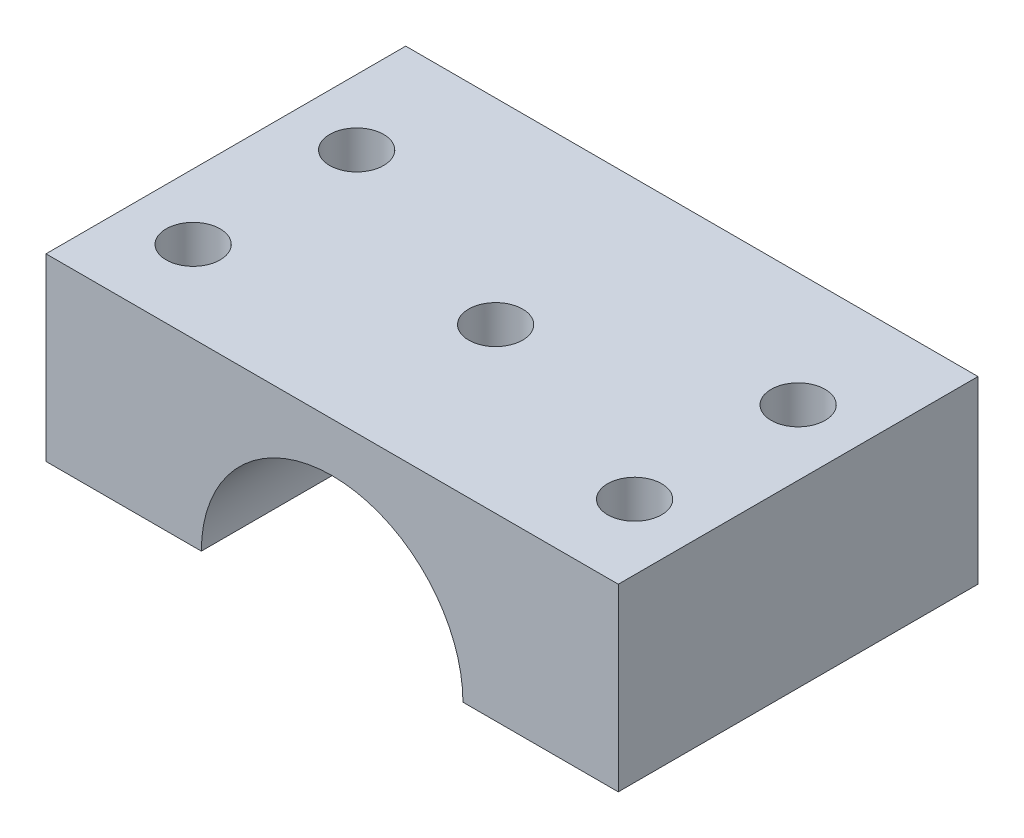
ISO-10303-21;
HEADER;
FILE_DESCRIPTION(('STEP AP214'),'2;1');
FILE_NAME('part.step','',(''),(''),'','','');
FILE_SCHEMA(('AUTOMOTIVE_DESIGN { 1 0 10303 214 1 1 1 1 }'));
ENDSEC;
DATA;
#1=APPLICATION_CONTEXT('core data for automotive mechanical design processes');
#2=APPLICATION_PROTOCOL_DEFINITION('international standard','automotive_design',2000,#1);
#3=PRODUCT_CONTEXT('',#1,'mechanical');
#4=PRODUCT('Part','Part','',(#3));
#5=PRODUCT_RELATED_PRODUCT_CATEGORY('part','',(#4));
#6=PRODUCT_DEFINITION_FORMATION('','',#4);
#7=PRODUCT_DEFINITION_CONTEXT('part definition',#1,'design');
#8=PRODUCT_DEFINITION('design','',#6,#7);
#9=PRODUCT_DEFINITION_SHAPE('','',#8);
#10=(LENGTH_UNIT() NAMED_UNIT(*) SI_UNIT(.MILLI.,.METRE.));
#11=(NAMED_UNIT(*) PLANE_ANGLE_UNIT() SI_UNIT($,.RADIAN.));
#12=(NAMED_UNIT(*) SI_UNIT($,.STERADIAN.) SOLID_ANGLE_UNIT());
#13=UNCERTAINTY_MEASURE_WITH_UNIT(LENGTH_MEASURE(1.E-05),#10,'distance_accuracy_value','');
#14=(GEOMETRIC_REPRESENTATION_CONTEXT(3) GLOBAL_UNCERTAINTY_ASSIGNED_CONTEXT((#13)) GLOBAL_UNIT_ASSIGNED_CONTEXT((#10,
#11,#12)) REPRESENTATION_CONTEXT('',''));
#15=CARTESIAN_POINT('',(0.,0.,0.));
#16=DIRECTION('',(0.,0.,1.));
#17=DIRECTION('',(1.,0.,0.));
#18=AXIS2_PLACEMENT_3D('',#15,#16,#17);
#19=CARTESIAN_POINT('',(0.,0.,22.));
#20=DIRECTION('',(0.,0.,-1.));
#21=DIRECTION('',(-1.,0.,0.));
#22=AXIS2_PLACEMENT_3D('',#19,#20,#21);
#23=CYLINDRICAL_SURFACE('',#22,8.00000000000002);
#24=CARTESIAN_POINT('',(0.,8.00000000000002,10.35));
#25=CARTESIAN_POINT('',(-0.0916407195421214,7.99999830466003,10.3500032970978));
#26=CARTESIAN_POINT('',(-0.183322508381991,7.99840926134727,10.3576603551884));
#27=CARTESIAN_POINT('',(-0.364090486799898,7.99222359173559,10.3880595356718));
#28=CARTESIAN_POINT('',(-0.453174626583019,7.98762465402598,10.4108132515387));
#29=CARTESIAN_POINT('',(-0.626107937761394,7.97593225373363,10.4706696077264));
#30=CARTESIAN_POINT('',(-0.709962177239571,7.96884125176523,10.507758097769));
#31=CARTESIAN_POINT('',(-0.870252949930907,7.95293377965834,10.5951882003391));
#32=CARTESIAN_POINT('',(-0.946689842831803,7.94411739325115,10.6455291697771));
#33=CARTESIAN_POINT('',(-1.09107850067237,7.92558648672409,10.7588010629735));
#34=CARTESIAN_POINT('',(-1.15890845453257,7.91586187136438,10.8218856235408));
#35=CARTESIAN_POINT('',(-1.28310256116972,7.8966832180565,10.9585238287823));
#36=CARTESIAN_POINT('',(-1.33946577881408,7.88722920223017,11.0320783264676));
#37=CARTESIAN_POINT('',(-1.43965110093203,7.86956329469157,11.188452611249));
#38=CARTESIAN_POINT('',(-1.48334592346543,7.86136437560848,11.2713555405184));
#39=CARTESIAN_POINT('',(-1.556138374432,7.847280862419,11.4435237634614));
#40=CARTESIAN_POINT('',(-1.58523754222915,7.84139602426696,11.5327883850498));
#41=CARTESIAN_POINT('',(-1.62761489438171,7.8327093467241,11.7138319499983));
#42=CARTESIAN_POINT('',(-1.64110744112713,7.82986577646948,11.805558673182));
#43=CARTESIAN_POINT('',(-1.65255460798121,7.82745807970269,11.9900145510084));
#44=CARTESIAN_POINT('',(-1.65051092017596,7.8278935960578,12.0827435953878));
#45=CARTESIAN_POINT('',(-1.6311166822238,7.8319569924966,12.2649954250817));
#46=CARTESIAN_POINT('',(-1.61401292403972,7.83553339981611,12.3545457923034));
#47=CARTESIAN_POINT('',(-1.56537407698979,7.84539445259548,12.5294781314775));
#48=CARTESIAN_POINT('',(-1.53383825960257,7.85167923477148,12.6148598927602));
#49=CARTESIAN_POINT('',(-1.4569977791722,7.8663009075181,12.7797369026918));
#50=CARTESIAN_POINT('',(-1.41159624906004,7.87465215408662,12.8591856807612));
#51=CARTESIAN_POINT('',(-1.3083813944234,7.89245670014426,13.0094292125401));
#52=CARTESIAN_POINT('',(-1.25056655688558,7.90191013391076,13.0802229096606));
#53=CARTESIAN_POINT('',(-1.12284972991962,7.92107619190931,13.2125697392375));
#54=CARTESIAN_POINT('',(-1.05273735419364,7.9307903116069,13.2739198087456));
#55=CARTESIAN_POINT('',(-0.903112309957829,7.94921762583847,13.3840215170254));
#56=CARTESIAN_POINT('',(-0.823599505782696,7.95793080592349,13.4327729739438));
#57=CARTESIAN_POINT('',(-0.657197902062822,7.97339804723508,13.516335206113));
#58=CARTESIAN_POINT('',(-0.570296555511042,7.98014868624197,13.5511216693748));
#59=CARTESIAN_POINT('',(-0.391712622109081,7.99090445204568,13.6055440308306));
#60=CARTESIAN_POINT('',(-0.30003065356669,7.99490993294789,13.6251818831259));
#61=CARTESIAN_POINT('',(-0.116231946363156,7.99967440549746,13.6484595408397));
#62=CARTESIAN_POINT('',(-0.0241517979908702,8.00048974989203,13.6523770728815));
#63=CARTESIAN_POINT('',(0.159347264679053,7.99893905822202,13.6448523983409));
#64=CARTESIAN_POINT('',(0.250766218290305,7.99657321289571,13.6334111126452));
#65=CARTESIAN_POINT('',(0.429444014904578,7.98896133117213,13.5957241871263));
#66=CARTESIAN_POINT('',(0.516734426475105,7.98374323165775,13.5696220779328));
#67=CARTESIAN_POINT('',(0.685699095825367,7.97101009225549,13.5035120917261));
#68=CARTESIAN_POINT('',(0.767372912734777,7.96349487230841,13.4635031245935));
#69=CARTESIAN_POINT('',(0.923949860452784,7.94686114142081,13.3701215244382));
#70=CARTESIAN_POINT('',(0.998751941729482,7.93772318016808,13.3165829964449));
#71=CARTESIAN_POINT('',(1.13840995014652,7.91890127310844,13.1978829604395));
#72=CARTESIAN_POINT('',(1.20326473664669,7.90921726486108,13.1327201213369));
#73=CARTESIAN_POINT('',(1.32226758953252,7.89020322125627,12.9913534748647));
#74=CARTESIAN_POINT('',(1.37622443804951,7.88088150077535,12.9149873836617));
#75=CARTESIAN_POINT('',(1.47054630126098,7.86382860657074,12.7541130800352));
#76=CARTESIAN_POINT('',(1.51091187665497,7.85609736723787,12.669605203681));
#77=CARTESIAN_POINT('',(1.57664965148858,7.84316897738334,12.4952828076236));
#78=CARTESIAN_POINT('',(1.60210202195352,7.83795830360764,12.4054995721084));
#79=CARTESIAN_POINT('',(1.63753157889189,7.83063366117502,12.2228109665722));
#80=CARTESIAN_POINT('',(1.64751092905126,7.82851925954995,12.1299060349335));
#81=CARTESIAN_POINT('',(1.65162714556419,7.82765166523678,11.945533659918));
#82=CARTESIAN_POINT('',(1.64606648188565,7.82883429816184,11.8540731386362));
#83=CARTESIAN_POINT('',(1.61993087801277,7.83428356728566,11.6734215755253));
#84=CARTESIAN_POINT('',(1.59935607582624,7.83855017513695,11.5842305128434));
#85=CARTESIAN_POINT('',(1.54391487276413,7.84965710898139,11.4108576515223));
#86=CARTESIAN_POINT('',(1.50908781763038,7.85649034513223,11.326662786976));
#87=CARTESIAN_POINT('',(1.42616638770593,7.87196421207749,11.1652646847897));
#88=CARTESIAN_POINT('',(1.37807081119504,7.88060500656399,11.0880620812752));
#89=CARTESIAN_POINT('',(1.26895419649462,7.89891524219784,10.9413387015049));
#90=CARTESIAN_POINT('',(1.20771563989217,7.90860042776135,10.8719816260355));
#91=CARTESIAN_POINT('',(1.07449788612549,7.92779756602152,10.7444283458794));
#92=CARTESIAN_POINT('',(1.00251622096492,7.93730947834754,10.6862347127904));
#93=CARTESIAN_POINT('',(0.848880613767894,7.95521487654739,10.5820385690572));
#94=CARTESIAN_POINT('',(0.767126900915487,7.9635945650388,10.536180687488));
#95=CARTESIAN_POINT('',(0.596921258332636,7.97815479541986,10.458927860048));
#96=CARTESIAN_POINT('',(0.508475311474865,7.98433727409234,10.4275201694818));
#97=CARTESIAN_POINT('',(0.349887562280623,7.99263694073893,10.3859858386167));
#98=CARTESIAN_POINT('',(0.280634724618696,7.99538162684995,10.3725157467451));
#99=CARTESIAN_POINT('',(0.140929326188157,7.99906377620173,10.3545217189296));
#100=CARTESIAN_POINT('',(0.0704768082405031,8.00000130381073,10.3499974643485));
#101=CARTESIAN_POINT('',(0.,8.00000000000002,10.35));
#102=B_SPLINE_CURVE_WITH_KNOTS('',3,(#24,#25,#26,#27,#28,#29,#30,#31,#32,#33,#34,#35,#36,#37,
#38,#39,#40,#41,#42,#43,#44,#45,#46,#47,#48,#49,#50,#51,#52,#53,#54,#55,#56,#57,#58,#59,#60,#61,
#62,#63,#64,#65,#66,#67,#68,#69,#70,#71,#72,#73,#74,#75,#76,#77,#78,#79,#80,#81,#82,#83,#84,#85,
#86,#87,#88,#89,#90,#91,#92,#93,#94,#95,#96,#97,#98,#99,#100,#101),.UNSPECIFIED.,.T.,.F.,(4,2,2,
2,2,2,2,2,2,2,2,2,2,2,2,2,2,2,2,2,2,2,2,2,2,2,2,2,2,2,2,2,2,2,2,2,2,2,4),(0.,0.274664286133512,
0.549539745146945,0.824144556648049,1.09873604513759,1.37686012616531,1.65500687961843,
1.93585838646539,2.21668026643688,2.49359735724628,2.77048428882734,3.04291655166271,
3.31536256822659,3.58975722869536,3.86418535314678,4.14387209364693,4.42356287102889,
4.70373847885486,4.98387793926425,5.25904586820428,5.53419729931632,5.80670078626853,
6.0792256388171,6.35526963287412,6.63134525682186,6.91190943522958,7.19246203771848,
7.47149225790372,7.75048345608711,8.0240824127032,8.29767885446866,8.57052502859216,
8.84339592230945,9.12118929442839,9.39904658206427,9.68003210657615,9.96076933178317,
10.1720089623927,10.3832410688304),.UNSPECIFIED.);
#103=CARTESIAN_POINT('',(0.,8.00000000000002,10.35));
#104=VERTEX_POINT('',#103);
#105=EDGE_CURVE('E140',#104,#104,#102,.T.);
#106=ORIENTED_EDGE('',*,*,#105,.T.);
#107=EDGE_LOOP('',(#106));
#108=FACE_BOUND('',#107,.T.);
#109=DIRECTION('',(0.,0.,-1.));
#110=VECTOR('',#109,1.);
#111=CARTESIAN_POINT('',(-8.00000000000002,0.,22.));
#112=LINE('',#111,#110);
#113=CARTESIAN_POINT('',(-8.00000000000002,0.,22.));
#114=VERTEX_POINT('',#113);
#115=CARTESIAN_POINT('',(-8.00000000000002,0.,2.));
#116=VERTEX_POINT('',#115);
#117=EDGE_CURVE('E132',#114,#116,#112,.T.);
#118=ORIENTED_EDGE('',*,*,#117,.T.);
#119=CARTESIAN_POINT('',(0.,0.,2.));
#120=DIRECTION('',(0.,0.,-1.));
#121=DIRECTION('',(-1.,0.,0.));
#122=AXIS2_PLACEMENT_3D('',#119,#120,#121);
#123=CIRCLE('',#122,8.00000000000002);
#124=CARTESIAN_POINT('',(8.00000000000002,0.,2.));
#125=VERTEX_POINT('',#124);
#126=EDGE_CURVE('E186',#116,#125,#123,.T.);
#127=ORIENTED_EDGE('',*,*,#126,.T.);
#128=DIRECTION('',(0.,0.,-1.));
#129=VECTOR('',#128,1.);
#130=CARTESIAN_POINT('',(8.00000000000002,0.,22.));
#131=LINE('',#130,#129);
#132=CARTESIAN_POINT('',(8.00000000000002,0.,22.));
#133=VERTEX_POINT('',#132);
#134=EDGE_CURVE('E11',#133,#125,#131,.T.);
#135=ORIENTED_EDGE('',*,*,#134,.F.);
#136=CARTESIAN_POINT('',(0.,0.,22.));
#137=DIRECTION('',(0.,0.,1.));
#138=DIRECTION('',(1.,0.,0.));
#139=AXIS2_PLACEMENT_3D('',#136,#137,#138);
#140=CIRCLE('',#139,8.00000000000002);
#141=EDGE_CURVE('E148',#133,#114,#140,.T.);
#142=ORIENTED_EDGE('',*,*,#141,.T.);
#143=EDGE_LOOP('',(#118,#127,#135,#142));
#144=FACE_BOUND('',#143,.T.);
#145=ADVANCED_FACE('F47',(#108,#144),#23,.F.);
#146=CARTESIAN_POINT('',(17.5,0.,22.));
#147=DIRECTION('',(1.,0.,0.));
#148=DIRECTION('',(0.,0.,-1.));
#149=AXIS2_PLACEMENT_3D('',#146,#147,#148);
#150=PLANE('',#149);
#151=DIRECTION('',(0.,0.,-1.));
#152=VECTOR('',#151,1.);
#153=CARTESIAN_POINT('',(17.5,0.,22.));
#154=LINE('',#153,#152);
#155=CARTESIAN_POINT('',(17.5,0.,22.));
#156=VERTEX_POINT('',#155);
#157=CARTESIAN_POINT('',(17.5,0.,0.));
#158=VERTEX_POINT('',#157);
#159=EDGE_CURVE('E58',#156,#158,#154,.T.);
#160=ORIENTED_EDGE('',*,*,#159,.T.);
#161=DIRECTION('',(0.,-1.,0.));
#162=VECTOR('',#161,1.);
#163=CARTESIAN_POINT('',(17.5,0.,0.));
#164=LINE('',#163,#162);
#165=CARTESIAN_POINT('',(17.5,11.,0.));
#166=VERTEX_POINT('',#165);
#167=EDGE_CURVE('E136',#166,#158,#164,.T.);
#168=ORIENTED_EDGE('',*,*,#167,.F.);
#169=DIRECTION('',(0.,0.,-1.));
#170=VECTOR('',#169,1.);
#171=CARTESIAN_POINT('',(17.5,11.,22.));
#172=LINE('',#171,#170);
#173=CARTESIAN_POINT('',(17.5,11.,22.));
#174=VERTEX_POINT('',#173);
#175=EDGE_CURVE('E119',#174,#166,#172,.T.);
#176=ORIENTED_EDGE('',*,*,#175,.F.);
#177=DIRECTION('',(0.,-1.,0.));
#178=VECTOR('',#177,1.);
#179=CARTESIAN_POINT('',(17.5,0.,22.));
#180=LINE('',#179,#178);
#181=EDGE_CURVE('E125',#174,#156,#180,.T.);
#182=ORIENTED_EDGE('',*,*,#181,.T.);
#183=EDGE_LOOP('',(#160,#168,#176,#182));
#184=FACE_BOUND('',#183,.T.);
#185=ADVANCED_FACE('F160',(#184),#150,.T.);
#186=CARTESIAN_POINT('',(0.,11.,22.));
#187=DIRECTION('',(0.,1.,0.));
#188=DIRECTION('',(0.,0.,1.));
#189=AXIS2_PLACEMENT_3D('',#186,#187,#188);
#190=PLANE('',#189);
#191=CARTESIAN_POINT('',(-13.5,11.,7.));
#192=DIRECTION('',(0.,-1.,0.));
#193=DIRECTION('',(1.,0.,0.));
#194=AXIS2_PLACEMENT_3D('',#191,#192,#193);
#195=CIRCLE('',#194,1.65);
#196=CARTESIAN_POINT('',(-11.85,11.,7.));
#197=VERTEX_POINT('',#196);
#198=EDGE_CURVE('E250',#197,#197,#195,.T.);
#199=ORIENTED_EDGE('',*,*,#198,.T.);
#200=EDGE_LOOP('',(#199));
#201=FACE_BOUND('',#200,.T.);
#202=CARTESIAN_POINT('',(13.5,11.,17.));
#203=DIRECTION('',(0.,-1.,0.));
#204=DIRECTION('',(1.,0.,0.));
#205=AXIS2_PLACEMENT_3D('',#202,#203,#204);
#206=CIRCLE('',#205,1.65);
#207=CARTESIAN_POINT('',(15.15,11.,17.));
#208=VERTEX_POINT('',#207);
#209=EDGE_CURVE('E237',#208,#208,#206,.T.);
#210=ORIENTED_EDGE('',*,*,#209,.T.);
#211=EDGE_LOOP('',(#210));
#212=FACE_BOUND('',#211,.T.);
#213=CARTESIAN_POINT('',(13.5,11.,7.));
#214=DIRECTION('',(0.,-1.,0.));
#215=DIRECTION('',(1.,0.,0.));
#216=AXIS2_PLACEMENT_3D('',#213,#214,#215);
#217=CIRCLE('',#216,1.65);
#218=CARTESIAN_POINT('',(15.15,11.,7.));
#219=VERTEX_POINT('',#218);
#220=EDGE_CURVE('E231',#219,#219,#217,.T.);
#221=ORIENTED_EDGE('',*,*,#220,.T.);
#222=EDGE_LOOP('',(#221));
#223=FACE_BOUND('',#222,.T.);
#224=CARTESIAN_POINT('',(-13.5,11.,17.));
#225=DIRECTION('',(0.,-1.,0.));
#226=DIRECTION('',(1.,0.,0.));
#227=AXIS2_PLACEMENT_3D('',#224,#225,#226);
#228=CIRCLE('',#227,1.65);
#229=CARTESIAN_POINT('',(-11.85,11.,17.));
#230=VERTEX_POINT('',#229);
#231=EDGE_CURVE('E192',#230,#230,#228,.T.);
#232=ORIENTED_EDGE('',*,*,#231,.T.);
#233=EDGE_LOOP('',(#232));
#234=FACE_BOUND('',#233,.T.);
#235=ORIENTED_EDGE('',*,*,#175,.T.);
#236=DIRECTION('',(1.,0.,0.));
#237=VECTOR('',#236,1.);
#238=CARTESIAN_POINT('',(0.,11.,0.));
#239=LINE('',#238,#237);
#240=CARTESIAN_POINT('',(-17.5,11.,0.));
#241=VERTEX_POINT('',#240);
#242=EDGE_CURVE('E115',#241,#166,#239,.T.);
#243=ORIENTED_EDGE('',*,*,#242,.F.);
#244=DIRECTION('',(0.,0.,-1.));
#245=VECTOR('',#244,1.);
#246=CARTESIAN_POINT('',(-17.5,11.,22.));
#247=LINE('',#246,#245);
#248=CARTESIAN_POINT('',(-17.5,11.,22.));
#249=VERTEX_POINT('',#248);
#250=EDGE_CURVE('E109',#249,#241,#247,.T.);
#251=ORIENTED_EDGE('',*,*,#250,.F.);
#252=DIRECTION('',(1.,0.,0.));
#253=VECTOR('',#252,1.);
#254=CARTESIAN_POINT('',(0.,11.,22.));
#255=LINE('',#254,#253);
#256=EDGE_CURVE('E114',#249,#174,#255,.T.);
#257=ORIENTED_EDGE('',*,*,#256,.T.);
#258=EDGE_LOOP('',(#235,#243,#251,#257));
#259=FACE_BOUND('',#258,.T.);
#260=CARTESIAN_POINT('',(0.,11.,12.));
#261=DIRECTION('',(0.,1.,0.));
#262=DIRECTION('',(0.,0.,1.));
#263=AXIS2_PLACEMENT_3D('',#260,#261,#262);
#264=CIRCLE('',#263,1.65);
#265=CARTESIAN_POINT('',(0.,11.,13.65));
#266=VERTEX_POINT('',#265);
#267=EDGE_CURVE('E51',#266,#266,#264,.F.);
#268=ORIENTED_EDGE('',*,*,#267,.T.);
#269=EDGE_LOOP('',(#268));
#270=FACE_BOUND('',#269,.T.);
#271=ADVANCED_FACE('F112',(#201,#212,#223,#234,#259,#270),#190,.T.);
#272=CARTESIAN_POINT('',(-17.5,0.,22.));
#273=DIRECTION('',(-1.,0.,0.));
#274=DIRECTION('',(0.,0.,1.));
#275=AXIS2_PLACEMENT_3D('',#272,#273,#274);
#276=PLANE('',#275);
#277=ORIENTED_EDGE('',*,*,#250,.T.);
#278=DIRECTION('',(0.,1.,0.));
#279=VECTOR('',#278,1.);
#280=CARTESIAN_POINT('',(-17.5,0.,0.));
#281=LINE('',#280,#279);
#282=CARTESIAN_POINT('',(-17.5,0.,0.));
#283=VERTEX_POINT('',#282);
#284=EDGE_CURVE('E84',#283,#241,#281,.T.);
#285=ORIENTED_EDGE('',*,*,#284,.F.);
#286=DIRECTION('',(0.,0.,-1.));
#287=VECTOR('',#286,1.);
#288=CARTESIAN_POINT('',(-17.5,0.,22.));
#289=LINE('',#288,#287);
#290=CARTESIAN_POINT('',(-17.5,0.,22.));
#291=VERTEX_POINT('',#290);
#292=EDGE_CURVE('E90',#291,#283,#289,.T.);
#293=ORIENTED_EDGE('',*,*,#292,.F.);
#294=DIRECTION('',(0.,1.,0.));
#295=VECTOR('',#294,1.);
#296=CARTESIAN_POINT('',(-17.5,0.,22.));
#297=LINE('',#296,#295);
#298=EDGE_CURVE('E123',#291,#249,#297,.T.);
#299=ORIENTED_EDGE('',*,*,#298,.T.);
#300=EDGE_LOOP('',(#277,#285,#293,#299));
#301=FACE_BOUND('',#300,.T.);
#302=ADVANCED_FACE('F128',(#301),#276,.T.);
#303=CARTESIAN_POINT('',(0.,0.,22.));
#304=DIRECTION('',(0.,1.,0.));
#305=DIRECTION('',(-1.,0.,0.));
#306=AXIS2_PLACEMENT_3D('',#303,#304,#305);
#307=PLANE('',#306);
#308=CARTESIAN_POINT('',(-13.5,0.,7.));
#309=DIRECTION('',(0.,-1.,0.));
#310=DIRECTION('',(1.,0.,0.));
#311=AXIS2_PLACEMENT_3D('',#308,#309,#310);
#312=CIRCLE('',#311,1.65);
#313=CARTESIAN_POINT('',(-11.85,0.,7.));
#314=VERTEX_POINT('',#313);
#315=EDGE_CURVE('E246',#314,#314,#312,.T.);
#316=ORIENTED_EDGE('',*,*,#315,.F.);
#317=EDGE_LOOP('',(#316));
#318=FACE_BOUND('',#317,.T.);
#319=CARTESIAN_POINT('',(13.5,0.,17.));
#320=DIRECTION('',(0.,-1.,0.));
#321=DIRECTION('',(1.,0.,0.));
#322=AXIS2_PLACEMENT_3D('',#319,#320,#321);
#323=CIRCLE('',#322,1.65);
#324=CARTESIAN_POINT('',(15.15,0.,17.));
#325=VERTEX_POINT('',#324);
#326=EDGE_CURVE('E242',#325,#325,#323,.T.);
#327=ORIENTED_EDGE('',*,*,#326,.F.);
#328=EDGE_LOOP('',(#327));
#329=FACE_BOUND('',#328,.T.);
#330=CARTESIAN_POINT('',(13.5,0.,7.));
#331=DIRECTION('',(0.,-1.,0.));
#332=DIRECTION('',(1.,0.,0.));
#333=AXIS2_PLACEMENT_3D('',#330,#331,#332);
#334=CIRCLE('',#333,1.65);
#335=CARTESIAN_POINT('',(15.15,0.,7.));
#336=VERTEX_POINT('',#335);
#337=EDGE_CURVE('E234',#336,#336,#334,.T.);
#338=ORIENTED_EDGE('',*,*,#337,.F.);
#339=EDGE_LOOP('',(#338));
#340=FACE_BOUND('',#339,.T.);
#341=CARTESIAN_POINT('',(-13.5,0.,17.));
#342=DIRECTION('',(0.,-1.,0.));
#343=DIRECTION('',(1.,0.,0.));
#344=AXIS2_PLACEMENT_3D('',#341,#342,#343);
#345=CIRCLE('',#344,1.65);
#346=CARTESIAN_POINT('',(-11.85,0.,17.));
#347=VERTEX_POINT('',#346);
#348=EDGE_CURVE('E198',#347,#347,#345,.T.);
#349=ORIENTED_EDGE('',*,*,#348,.F.);
#350=EDGE_LOOP('',(#349));
#351=FACE_BOUND('',#350,.T.);
#352=DIRECTION('',(1.,0.,0.));
#353=VECTOR('',#352,1.);
#354=CARTESIAN_POINT('',(0.,0.,0.));
#355=LINE('',#354,#353);
#356=EDGE_CURVE('E145',#283,#158,#355,.T.);
#357=ORIENTED_EDGE('',*,*,#356,.T.);
#358=ORIENTED_EDGE('',*,*,#159,.F.);
#359=DIRECTION('',(1.,0.,0.));
#360=VECTOR('',#359,1.);
#361=CARTESIAN_POINT('',(0.,0.,22.));
#362=LINE('',#361,#360);
#363=EDGE_CURVE('E444',#133,#156,#362,.T.);
#364=ORIENTED_EDGE('',*,*,#363,.F.);
#365=ORIENTED_EDGE('',*,*,#134,.T.);
#366=DIRECTION('',(-1.,0.,0.));
#367=VECTOR('',#366,1.);
#368=CARTESIAN_POINT('',(0.,0.,2.));
#369=LINE('',#368,#367);
#370=EDGE_CURVE('E189',#125,#116,#369,.T.);
#371=ORIENTED_EDGE('',*,*,#370,.T.);
#372=ORIENTED_EDGE('',*,*,#117,.F.);
#373=DIRECTION('',(1.,0.,0.));
#374=VECTOR('',#373,1.);
#375=CARTESIAN_POINT('',(0.,0.,22.));
#376=LINE('',#375,#374);
#377=EDGE_CURVE('E66',#291,#114,#376,.T.);
#378=ORIENTED_EDGE('',*,*,#377,.F.);
#379=ORIENTED_EDGE('',*,*,#292,.T.);
#380=EDGE_LOOP('',(#357,#358,#364,#365,#371,#372,#378,#379));
#381=FACE_BOUND('',#380,.T.);
#382=ADVANCED_FACE('F161',(#318,#329,#340,#351,#381),#307,.F.);
#383=CARTESIAN_POINT('',(0.,0.,22.));
#384=DIRECTION('',(0.,0.,1.));
#385=DIRECTION('',(1.,0.,0.));
#386=AXIS2_PLACEMENT_3D('',#383,#384,#385);
#387=PLANE('',#386);
#388=ORIENTED_EDGE('',*,*,#141,.F.);
#389=ORIENTED_EDGE('',*,*,#363,.T.);
#390=ORIENTED_EDGE('',*,*,#181,.F.);
#391=ORIENTED_EDGE('',*,*,#256,.F.);
#392=ORIENTED_EDGE('',*,*,#298,.F.);
#393=ORIENTED_EDGE('',*,*,#377,.T.);
#394=EDGE_LOOP('',(#388,#389,#390,#391,#392,#393));
#395=FACE_BOUND('',#394,.T.);
#396=ADVANCED_FACE('F122',(#395),#387,.T.);
#397=CARTESIAN_POINT('',(0.,0.,0.));
#398=DIRECTION('',(0.,0.,1.));
#399=DIRECTION('',(1.,0.,0.));
#400=AXIS2_PLACEMENT_3D('',#397,#398,#399);
#401=PLANE('',#400);
#402=ORIENTED_EDGE('',*,*,#167,.T.);
#403=ORIENTED_EDGE('',*,*,#356,.F.);
#404=ORIENTED_EDGE('',*,*,#284,.T.);
#405=ORIENTED_EDGE('',*,*,#242,.T.);
#406=EDGE_LOOP('',(#402,#403,#404,#405));
#407=FACE_BOUND('',#406,.T.);
#408=ADVANCED_FACE('F162',(#407),#401,.F.);
#409=CARTESIAN_POINT('',(0.,19.,12.));
#410=DIRECTION('',(0.,-1.,0.));
#411=DIRECTION('',(0.,0.,-1.));
#412=AXIS2_PLACEMENT_3D('',#409,#410,#411);
#413=CYLINDRICAL_SURFACE('',#412,1.65);
#414=ORIENTED_EDGE('',*,*,#105,.F.);
#415=EDGE_LOOP('',(#414));
#416=FACE_BOUND('',#415,.T.);
#417=ORIENTED_EDGE('',*,*,#267,.F.);
#418=EDGE_LOOP('',(#417));
#419=FACE_BOUND('',#418,.T.);
#420=ADVANCED_FACE('F164',(#416,#419),#413,.F.);
#421=CARTESIAN_POINT('',(0.,0.,2.));
#422=DIRECTION('',(0.,0.,-1.));
#423=DIRECTION('',(-1.,0.,0.));
#424=AXIS2_PLACEMENT_3D('',#421,#422,#423);
#425=PLANE('',#424);
#426=ORIENTED_EDGE('',*,*,#126,.F.);
#427=ORIENTED_EDGE('',*,*,#370,.F.);
#428=EDGE_LOOP('',(#426,#427));
#429=FACE_BOUND('',#428,.T.);
#430=ADVANCED_FACE('F171',(#429),#425,.F.);
#431=CARTESIAN_POINT('',(-13.5,11.,17.));
#432=DIRECTION('',(0.,-1.,0.));
#433=DIRECTION('',(1.,0.,0.));
#434=AXIS2_PLACEMENT_3D('',#431,#432,#433);
#435=CYLINDRICAL_SURFACE('',#434,1.65);
#436=ORIENTED_EDGE('',*,*,#231,.F.);
#437=EDGE_LOOP('',(#436));
#438=FACE_BOUND('',#437,.T.);
#439=ORIENTED_EDGE('',*,*,#348,.T.);
#440=EDGE_LOOP('',(#439));
#441=FACE_BOUND('',#440,.T.);
#442=ADVANCED_FACE('F211',(#438,#441),#435,.F.);
#443=CARTESIAN_POINT('',(13.5,11.,7.));
#444=DIRECTION('',(0.,-1.,0.));
#445=DIRECTION('',(1.,0.,0.));
#446=AXIS2_PLACEMENT_3D('',#443,#444,#445);
#447=CYLINDRICAL_SURFACE('',#446,1.65);
#448=ORIENTED_EDGE('',*,*,#220,.F.);
#449=EDGE_LOOP('',(#448));
#450=FACE_BOUND('',#449,.T.);
#451=ORIENTED_EDGE('',*,*,#337,.T.);
#452=EDGE_LOOP('',(#451));
#453=FACE_BOUND('',#452,.T.);
#454=ADVANCED_FACE('F214',(#450,#453),#447,.F.);
#455=CARTESIAN_POINT('',(13.5,11.,17.));
#456=DIRECTION('',(0.,-1.,0.));
#457=DIRECTION('',(1.,0.,0.));
#458=AXIS2_PLACEMENT_3D('',#455,#456,#457);
#459=CYLINDRICAL_SURFACE('',#458,1.65);
#460=ORIENTED_EDGE('',*,*,#209,.F.);
#461=EDGE_LOOP('',(#460));
#462=FACE_BOUND('',#461,.T.);
#463=ORIENTED_EDGE('',*,*,#326,.T.);
#464=EDGE_LOOP('',(#463));
#465=FACE_BOUND('',#464,.T.);
#466=ADVANCED_FACE('F216',(#462,#465),#459,.F.);
#467=CARTESIAN_POINT('',(-13.5,11.,7.));
#468=DIRECTION('',(0.,-1.,0.));
#469=DIRECTION('',(1.,0.,0.));
#470=AXIS2_PLACEMENT_3D('',#467,#468,#469);
#471=CYLINDRICAL_SURFACE('',#470,1.65);
#472=ORIENTED_EDGE('',*,*,#198,.F.);
#473=EDGE_LOOP('',(#472));
#474=FACE_BOUND('',#473,.T.);
#475=ORIENTED_EDGE('',*,*,#315,.T.);
#476=EDGE_LOOP('',(#475));
#477=FACE_BOUND('',#476,.T.);
#478=ADVANCED_FACE('F219',(#474,#477),#471,.F.);
#479=CLOSED_SHELL('',(#145,#185,#271,#302,#382,#396,#408,#420,#430,#442,#454,#466,#478));
#480=MANIFOLD_SOLID_BREP('B2',#479);
#481=ADVANCED_BREP_SHAPE_REPRESENTATION('',(#18,#480),#14);
#482=SHAPE_DEFINITION_REPRESENTATION(#9,#481);
ENDSEC;
END-ISO-10303-21;
